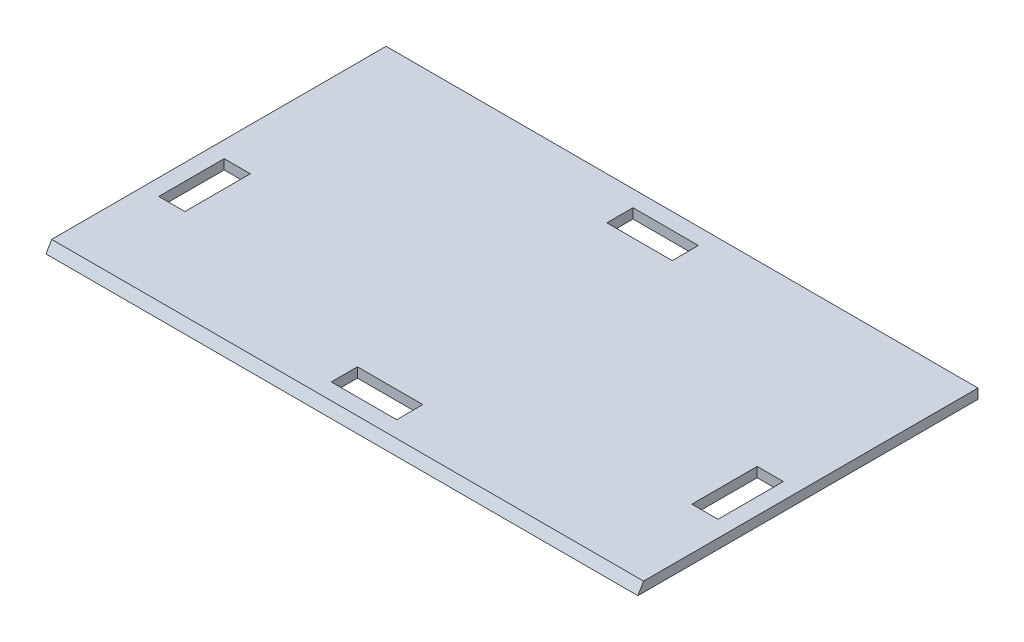
ISO-10303-21;
HEADER;
FILE_DESCRIPTION(('STEP AP214'),'2;1');
FILE_NAME('part.step','',(''),(''),'','','');
FILE_SCHEMA(('AUTOMOTIVE_DESIGN { 1 0 10303 214 1 1 1 1 }'));
ENDSEC;
DATA;
#1=APPLICATION_CONTEXT('core data for automotive mechanical design processes');
#2=APPLICATION_PROTOCOL_DEFINITION('international standard','automotive_design',2000,#1);
#3=PRODUCT_CONTEXT('',#1,'mechanical');
#4=PRODUCT('Part','Part','',(#3));
#5=PRODUCT_RELATED_PRODUCT_CATEGORY('part','',(#4));
#6=PRODUCT_DEFINITION_FORMATION('','',#4);
#7=PRODUCT_DEFINITION_CONTEXT('part definition',#1,'design');
#8=PRODUCT_DEFINITION('design','',#6,#7);
#9=PRODUCT_DEFINITION_SHAPE('','',#8);
#10=(LENGTH_UNIT() NAMED_UNIT(*) SI_UNIT(.MILLI.,.METRE.));
#11=(NAMED_UNIT(*) PLANE_ANGLE_UNIT() SI_UNIT($,.RADIAN.));
#12=(NAMED_UNIT(*) SI_UNIT($,.STERADIAN.) SOLID_ANGLE_UNIT());
#13=UNCERTAINTY_MEASURE_WITH_UNIT(LENGTH_MEASURE(1.E-05),#10,'distance_accuracy_value','');
#14=(GEOMETRIC_REPRESENTATION_CONTEXT(3) GLOBAL_UNCERTAINTY_ASSIGNED_CONTEXT((#13)) GLOBAL_UNIT_ASSIGNED_CONTEXT((#10,
#11,#12)) REPRESENTATION_CONTEXT('',''));
#15=CARTESIAN_POINT('',(0.,0.,0.));
#16=DIRECTION('',(0.,0.,1.));
#17=DIRECTION('',(1.,0.,0.));
#18=AXIS2_PLACEMENT_3D('',#15,#16,#17);
#19=CARTESIAN_POINT('',(-181.,16.1816182466845,-0.351294642809544));
#20=DIRECTION('',(0.,-1.,0.));
#21=DIRECTION('',(0.,0.,-1.));
#22=AXIS2_PLACEMENT_3D('',#19,#20,#21);
#23=PLANE('',#22);
#24=DIRECTION('',(0.,0.,-1.));
#25=VECTOR('',#24,1.);
#26=CARTESIAN_POINT('',(-100.499224225358,16.1816182466845,-0.351294642809544));
#27=LINE('',#26,#25);
#28=CARTESIAN_POINT('',(-100.499224225358,16.1816182466845,-91.3512946428095));
#29=VERTEX_POINT('',#28);
#30=CARTESIAN_POINT('',(-100.499224225358,16.1816182466845,-99.3512946428095));
#31=VERTEX_POINT('',#30);
#32=EDGE_CURVE('E301',#29,#31,#27,.T.);
#33=ORIENTED_EDGE('',*,*,#32,.F.);
#34=DIRECTION('',(-1.,0.,0.));
#35=VECTOR('',#34,1.);
#36=CARTESIAN_POINT('',(-181.,16.1816182466845,-91.3512946428095));
#37=LINE('',#36,#35);
#38=CARTESIAN_POINT('',(-80.4992242253577,16.1816182466845,-91.3512946428095));
#39=VERTEX_POINT('',#38);
#40=EDGE_CURVE('E294',#39,#29,#37,.T.);
#41=ORIENTED_EDGE('',*,*,#40,.F.);
#42=DIRECTION('',(0.,0.,1.));
#43=VECTOR('',#42,1.);
#44=CARTESIAN_POINT('',(-80.4992242253575,16.1816182466845,-0.351294642809718));
#45=LINE('',#44,#43);
#46=CARTESIAN_POINT('',(-80.4992242253577,16.1816182466845,-99.3512946428095));
#47=VERTEX_POINT('',#46);
#48=EDGE_CURVE('E296',#47,#39,#45,.T.);
#49=ORIENTED_EDGE('',*,*,#48,.F.);
#50=DIRECTION('',(1.,0.,0.));
#51=VECTOR('',#50,1.);
#52=CARTESIAN_POINT('',(-181.,16.1816182466845,-99.3512946428095));
#53=LINE('',#52,#51);
#54=EDGE_CURVE('E299',#31,#47,#53,.T.);
#55=ORIENTED_EDGE('',*,*,#54,.F.);
#56=EDGE_LOOP('',(#33,#41,#49,#55));
#57=FACE_BOUND('',#56,.T.);
#58=DIRECTION('',(0.,0.,1.));
#59=VECTOR('',#58,1.);
#60=CARTESIAN_POINT('',(-4.99922422535767,16.1816182466845,-0.351294642809567));
#61=LINE('',#60,#59);
#62=CARTESIAN_POINT('',(-4.99922422535766,16.1816182466845,-49.8315486806539));
#63=VERTEX_POINT('',#62);
#64=CARTESIAN_POINT('',(-4.99922422535766,16.1816182466845,-29.8315486806539));
#65=VERTEX_POINT('',#64);
#66=EDGE_CURVE('E292',#63,#65,#61,.T.);
#67=ORIENTED_EDGE('',*,*,#66,.F.);
#68=DIRECTION('',(1.,0.,0.));
#69=VECTOR('',#68,1.);
#70=CARTESIAN_POINT('',(-181.,16.1816182466845,-49.8315486806539));
#71=LINE('',#70,#69);
#72=CARTESIAN_POINT('',(-12.9992242253577,16.1816182466845,-49.8315486806539));
#73=VERTEX_POINT('',#72);
#74=EDGE_CURVE('E261',#73,#63,#71,.T.);
#75=ORIENTED_EDGE('',*,*,#74,.F.);
#76=DIRECTION('',(0.,0.,-1.));
#77=VECTOR('',#76,1.);
#78=CARTESIAN_POINT('',(-12.9992242253577,16.1816182466845,-0.351294642809544));
#79=LINE('',#78,#77);
#80=CARTESIAN_POINT('',(-12.9992242253577,16.1816182466845,-29.8315486806539));
#81=VERTEX_POINT('',#80);
#82=EDGE_CURVE('E287',#81,#73,#79,.T.);
#83=ORIENTED_EDGE('',*,*,#82,.F.);
#84=DIRECTION('',(-1.,0.,0.));
#85=VECTOR('',#84,1.);
#86=CARTESIAN_POINT('',(-181.,16.1816182466845,-29.8315486806539));
#87=LINE('',#86,#85);
#88=EDGE_CURVE('E290',#65,#81,#87,.T.);
#89=ORIENTED_EDGE('',*,*,#88,.F.);
#90=EDGE_LOOP('',(#67,#75,#83,#89));
#91=FACE_BOUND('',#90,.T.);
#92=DIRECTION('',(0.,0.,-1.));
#93=VECTOR('',#92,1.);
#94=CARTESIAN_POINT('',(0.,16.1816182466845,-0.351294642809544));
#95=LINE('',#94,#93);
#96=CARTESIAN_POINT('',(0.,16.1816182466845,-0.351294642809544));
#97=VERTEX_POINT('',#96);
#98=CARTESIAN_POINT('',(0.,16.1816182466845,-104.35129464281));
#99=VERTEX_POINT('',#98);
#100=EDGE_CURVE('E303',#97,#99,#95,.T.);
#101=ORIENTED_EDGE('',*,*,#100,.F.);
#102=DIRECTION('',(1.,0.,0.));
#103=VECTOR('',#102,1.);
#104=CARTESIAN_POINT('',(-181.,16.1816182466845,-0.351294642809544));
#105=LINE('',#104,#103);
#106=CARTESIAN_POINT('',(-181.,16.1816182466845,-0.351294642809544));
#107=VERTEX_POINT('',#106);
#108=EDGE_CURVE('E11',#107,#97,#105,.T.);
#109=ORIENTED_EDGE('',*,*,#108,.F.);
#110=DIRECTION('',(0.,0.,-1.));
#111=VECTOR('',#110,1.);
#112=CARTESIAN_POINT('',(-181.,16.1816182466845,-0.351294642809544));
#113=LINE('',#112,#111);
#114=CARTESIAN_POINT('',(-181.,16.1816182466845,-104.35129464281));
#115=VERTEX_POINT('',#114);
#116=EDGE_CURVE('E304',#107,#115,#113,.T.);
#117=ORIENTED_EDGE('',*,*,#116,.T.);
#118=DIRECTION('',(1.,0.,0.));
#119=VECTOR('',#118,1.);
#120=CARTESIAN_POINT('',(-181.,16.1816182466845,-104.35129464281));
#121=LINE('',#120,#119);
#122=EDGE_CURVE('E42',#115,#99,#121,.T.);
#123=ORIENTED_EDGE('',*,*,#122,.T.);
#124=EDGE_LOOP('',(#101,#109,#117,#123));
#125=FACE_BOUND('',#124,.T.);
#126=DIRECTION('',(-1.,0.,0.));
#127=VECTOR('',#126,1.);
#128=CARTESIAN_POINT('',(-181.,16.1816182466845,-49.8315486806539));
#129=LINE('',#128,#127);
#130=CARTESIAN_POINT('',(-167.999224225358,16.1816182466845,-49.8315486806539));
#131=VERTEX_POINT('',#130);
#132=CARTESIAN_POINT('',(-175.999224225358,16.1816182466845,-49.8315486806539));
#133=VERTEX_POINT('',#132);
#134=EDGE_CURVE('E239',#131,#133,#129,.T.);
#135=ORIENTED_EDGE('',*,*,#134,.T.);
#136=DIRECTION('',(0.,0.,1.));
#137=VECTOR('',#136,1.);
#138=CARTESIAN_POINT('',(-175.999224225358,16.1816182466845,-0.351294642809543));
#139=LINE('',#138,#137);
#140=CARTESIAN_POINT('',(-175.999224225358,16.1816182466845,-29.8315486806539));
#141=VERTEX_POINT('',#140);
#142=EDGE_CURVE('E242',#133,#141,#139,.T.);
#143=ORIENTED_EDGE('',*,*,#142,.T.);
#144=DIRECTION('',(1.,0.,0.));
#145=VECTOR('',#144,1.);
#146=CARTESIAN_POINT('',(-181.,16.1816182466845,-29.8315486806539));
#147=LINE('',#146,#145);
#148=CARTESIAN_POINT('',(-167.999224225358,16.1816182466845,-29.8315486806539));
#149=VERTEX_POINT('',#148);
#150=EDGE_CURVE('E227',#141,#149,#147,.T.);
#151=ORIENTED_EDGE('',*,*,#150,.T.);
#152=DIRECTION('',(0.,0.,-1.));
#153=VECTOR('',#152,1.);
#154=CARTESIAN_POINT('',(-167.999224225358,16.1816182466845,-0.351294642809544));
#155=LINE('',#154,#153);
#156=EDGE_CURVE('E236',#149,#131,#155,.T.);
#157=ORIENTED_EDGE('',*,*,#156,.T.);
#158=EDGE_LOOP('',(#135,#143,#151,#157));
#159=FACE_BOUND('',#158,.T.);
#160=DIRECTION('',(-1.,0.,0.));
#161=VECTOR('',#160,1.);
#162=CARTESIAN_POINT('',(-181.,16.1816182466845,-15.0812946428096));
#163=LINE('',#162,#161);
#164=CARTESIAN_POINT('',(-80.4992242253577,16.1816182466845,-15.0812946428096));
#165=VERTEX_POINT('',#164);
#166=CARTESIAN_POINT('',(-100.499224225358,16.1816182466845,-15.0812946428096));
#167=VERTEX_POINT('',#166);
#168=EDGE_CURVE('E206',#165,#167,#163,.T.);
#169=ORIENTED_EDGE('',*,*,#168,.T.);
#170=DIRECTION('',(0.,0.,1.));
#171=VECTOR('',#170,1.);
#172=CARTESIAN_POINT('',(-100.499224225358,16.1816182466845,-0.351294642809544));
#173=LINE('',#172,#171);
#174=CARTESIAN_POINT('',(-100.499224225358,16.1816182466845,-7.08129464280954));
#175=VERTEX_POINT('',#174);
#176=EDGE_CURVE('E209',#167,#175,#173,.T.);
#177=ORIENTED_EDGE('',*,*,#176,.T.);
#178=DIRECTION('',(1.,0.,0.));
#179=VECTOR('',#178,1.);
#180=CARTESIAN_POINT('',(-181.,16.1816182466845,-7.08129464280954));
#181=LINE('',#180,#179);
#182=CARTESIAN_POINT('',(-80.4992242253577,16.1816182466845,-7.08129464280954));
#183=VERTEX_POINT('',#182);
#184=EDGE_CURVE('E201',#175,#183,#181,.T.);
#185=ORIENTED_EDGE('',*,*,#184,.T.);
#186=DIRECTION('',(0.,0.,-1.));
#187=VECTOR('',#186,1.);
#188=CARTESIAN_POINT('',(-80.4992242253577,16.1816182466845,-0.351294642809369));
#189=LINE('',#188,#187);
#190=EDGE_CURVE('E182',#183,#165,#189,.T.);
#191=ORIENTED_EDGE('',*,*,#190,.T.);
#192=EDGE_LOOP('',(#169,#177,#185,#191));
#193=FACE_BOUND('',#192,.T.);
#194=ADVANCED_FACE('F39',(#57,#91,#125,#159,#193),#23,.T.);
#195=CARTESIAN_POINT('',(-181.,19.1816182466845,-2.08334545037842));
#196=DIRECTION('',(0.,1.,0.));
#197=DIRECTION('',(0.,0.,1.));
#198=AXIS2_PLACEMENT_3D('',#195,#196,#197);
#199=PLANE('',#198);
#200=DIRECTION('',(0.,0.,1.));
#201=VECTOR('',#200,1.);
#202=CARTESIAN_POINT('',(-100.499224225358,19.1816182466845,-99.3512946428095));
#203=LINE('',#202,#201);
#204=CARTESIAN_POINT('',(-100.499224225358,19.1816182466845,-99.3512946428095));
#205=VERTEX_POINT('',#204);
#206=CARTESIAN_POINT('',(-100.499224225358,19.1816182466845,-91.3512946428095));
#207=VERTEX_POINT('',#206);
#208=EDGE_CURVE('E246',#205,#207,#203,.T.);
#209=ORIENTED_EDGE('',*,*,#208,.F.);
#210=DIRECTION('',(-1.,0.,0.));
#211=VECTOR('',#210,1.);
#212=CARTESIAN_POINT('',(-100.499224225358,19.1816182466845,-99.3512946428095));
#213=LINE('',#212,#211);
#214=CARTESIAN_POINT('',(-80.4992242253577,19.1816182466845,-99.3512946428095));
#215=VERTEX_POINT('',#214);
#216=EDGE_CURVE('E255',#215,#205,#213,.T.);
#217=ORIENTED_EDGE('',*,*,#216,.F.);
#218=DIRECTION('',(0.,0.,-1.));
#219=VECTOR('',#218,1.);
#220=CARTESIAN_POINT('',(-80.4992242253577,19.1816182466845,-99.3512946428095));
#221=LINE('',#220,#219);
#222=CARTESIAN_POINT('',(-80.4992242253577,19.1816182466845,-91.3512946428095));
#223=VERTEX_POINT('',#222);
#224=EDGE_CURVE('E252',#223,#215,#221,.T.);
#225=ORIENTED_EDGE('',*,*,#224,.F.);
#226=DIRECTION('',(1.,0.,0.));
#227=VECTOR('',#226,1.);
#228=CARTESIAN_POINT('',(-100.499224225358,19.1816182466845,-91.3512946428095));
#229=LINE('',#228,#227);
#230=EDGE_CURVE('E248',#207,#223,#229,.T.);
#231=ORIENTED_EDGE('',*,*,#230,.F.);
#232=EDGE_LOOP('',(#209,#217,#225,#231));
#233=FACE_BOUND('',#232,.T.);
#234=DIRECTION('',(0.,0.,-1.));
#235=VECTOR('',#234,1.);
#236=CARTESIAN_POINT('',(-4.99922422535766,19.1816182466845,-49.8315486806539));
#237=LINE('',#236,#235);
#238=CARTESIAN_POINT('',(-4.99922422535766,19.1816182466845,-29.8315486806539));
#239=VERTEX_POINT('',#238);
#240=CARTESIAN_POINT('',(-4.99922422535767,19.1816182466845,-49.8315486806539));
#241=VERTEX_POINT('',#240);
#242=EDGE_CURVE('E249',#239,#241,#237,.T.);
#243=ORIENTED_EDGE('',*,*,#242,.F.);
#244=DIRECTION('',(1.,0.,0.));
#245=VECTOR('',#244,1.);
#246=CARTESIAN_POINT('',(-4.99922422535766,19.1816182466845,-29.8315486806539));
#247=LINE('',#246,#245);
#248=CARTESIAN_POINT('',(-12.9992242253577,19.1816182466845,-29.8315486806539));
#249=VERTEX_POINT('',#248);
#250=EDGE_CURVE('E271',#249,#239,#247,.T.);
#251=ORIENTED_EDGE('',*,*,#250,.F.);
#252=DIRECTION('',(0.,0.,1.));
#253=VECTOR('',#252,1.);
#254=CARTESIAN_POINT('',(-12.9992242253577,19.1816182466845,-49.8315486806539));
#255=LINE('',#254,#253);
#256=CARTESIAN_POINT('',(-12.9992242253577,19.1816182466845,-49.8315486806539));
#257=VERTEX_POINT('',#256);
#258=EDGE_CURVE('E279',#257,#249,#255,.T.);
#259=ORIENTED_EDGE('',*,*,#258,.F.);
#260=DIRECTION('',(-1.,0.,0.));
#261=VECTOR('',#260,1.);
#262=CARTESIAN_POINT('',(-4.99922422535766,19.1816182466845,-49.8315486806539));
#263=LINE('',#262,#261);
#264=EDGE_CURVE('E282',#241,#257,#263,.T.);
#265=ORIENTED_EDGE('',*,*,#264,.F.);
#266=EDGE_LOOP('',(#243,#251,#259,#265));
#267=FACE_BOUND('',#266,.T.);
#268=DIRECTION('',(0.,0.,1.));
#269=VECTOR('',#268,1.);
#270=CARTESIAN_POINT('',(0.,19.1816182466845,-2.08334545037842));
#271=LINE('',#270,#269);
#272=CARTESIAN_POINT('',(0.,19.1816182466845,-104.35129464281));
#273=VERTEX_POINT('',#272);
#274=CARTESIAN_POINT('',(0.,19.1816182466845,-2.08334545037842));
#275=VERTEX_POINT('',#274);
#276=EDGE_CURVE('E322',#273,#275,#271,.T.);
#277=ORIENTED_EDGE('',*,*,#276,.F.);
#278=DIRECTION('',(1.,0.,0.));
#279=VECTOR('',#278,1.);
#280=CARTESIAN_POINT('',(-181.,19.1816182466845,-104.35129464281));
#281=LINE('',#280,#279);
#282=CARTESIAN_POINT('',(-181.,19.1816182466845,-104.35129464281));
#283=VERTEX_POINT('',#282);
#284=EDGE_CURVE('E327',#283,#273,#281,.T.);
#285=ORIENTED_EDGE('',*,*,#284,.F.);
#286=DIRECTION('',(0.,0.,1.));
#287=VECTOR('',#286,1.);
#288=CARTESIAN_POINT('',(-181.,19.1816182466845,-2.08334545037842));
#289=LINE('',#288,#287);
#290=CARTESIAN_POINT('',(-181.,19.1816182466845,-2.08334545037842));
#291=VERTEX_POINT('',#290);
#292=EDGE_CURVE('E311',#283,#291,#289,.T.);
#293=ORIENTED_EDGE('',*,*,#292,.T.);
#294=DIRECTION('',(1.,0.,0.));
#295=VECTOR('',#294,1.);
#296=CARTESIAN_POINT('',(-181.,19.1816182466845,-2.08334545037842));
#297=LINE('',#296,#295);
#298=EDGE_CURVE('E47',#291,#275,#297,.T.);
#299=ORIENTED_EDGE('',*,*,#298,.T.);
#300=EDGE_LOOP('',(#277,#285,#293,#299));
#301=FACE_BOUND('',#300,.T.);
#302=DIRECTION('',(-1.,0.,0.));
#303=VECTOR('',#302,1.);
#304=CARTESIAN_POINT('',(-175.999224225358,19.1816182466845,-29.8315486806539));
#305=LINE('',#304,#303);
#306=CARTESIAN_POINT('',(-167.999224225358,19.1816182466845,-29.8315486806539));
#307=VERTEX_POINT('',#306);
#308=CARTESIAN_POINT('',(-175.999224225358,19.1816182466845,-29.8315486806539));
#309=VERTEX_POINT('',#308);
#310=EDGE_CURVE('E215',#307,#309,#305,.T.);
#311=ORIENTED_EDGE('',*,*,#310,.T.);
#312=DIRECTION('',(0.,0.,-1.));
#313=VECTOR('',#312,1.);
#314=CARTESIAN_POINT('',(-175.999224225358,19.1816182466845,-49.8315486806539));
#315=LINE('',#314,#313);
#316=CARTESIAN_POINT('',(-175.999224225358,19.1816182466845,-49.8315486806539));
#317=VERTEX_POINT('',#316);
#318=EDGE_CURVE('E212',#309,#317,#315,.T.);
#319=ORIENTED_EDGE('',*,*,#318,.T.);
#320=DIRECTION('',(1.,0.,0.));
#321=VECTOR('',#320,1.);
#322=CARTESIAN_POINT('',(-175.999224225358,19.1816182466845,-49.8315486806539));
#323=LINE('',#322,#321);
#324=CARTESIAN_POINT('',(-167.999224225358,19.1816182466845,-49.8315486806539));
#325=VERTEX_POINT('',#324);
#326=EDGE_CURVE('E221',#317,#325,#323,.T.);
#327=ORIENTED_EDGE('',*,*,#326,.T.);
#328=DIRECTION('',(0.,0.,1.));
#329=VECTOR('',#328,1.);
#330=CARTESIAN_POINT('',(-167.999224225358,19.1816182466845,-49.8315486806539));
#331=LINE('',#330,#329);
#332=EDGE_CURVE('E218',#325,#307,#331,.T.);
#333=ORIENTED_EDGE('',*,*,#332,.T.);
#334=EDGE_LOOP('',(#311,#319,#327,#333));
#335=FACE_BOUND('',#334,.T.);
#336=DIRECTION('',(-1.,0.,0.));
#337=VECTOR('',#336,1.);
#338=CARTESIAN_POINT('',(-100.499224225358,19.1816182466845,-7.08129464280954));
#339=LINE('',#338,#337);
#340=CARTESIAN_POINT('',(-80.4992242253577,19.1816182466845,-7.08129464280954));
#341=VERTEX_POINT('',#340);
#342=CARTESIAN_POINT('',(-100.499224225358,19.1816182466845,-7.08129464280954));
#343=VERTEX_POINT('',#342);
#344=EDGE_CURVE('E188',#341,#343,#339,.T.);
#345=ORIENTED_EDGE('',*,*,#344,.T.);
#346=DIRECTION('',(0.,0.,-1.));
#347=VECTOR('',#346,1.);
#348=CARTESIAN_POINT('',(-100.499224225358,19.1816182466845,-7.08129464280954));
#349=LINE('',#348,#347);
#350=CARTESIAN_POINT('',(-100.499224225358,19.1816182466845,-15.0812946428096));
#351=VERTEX_POINT('',#350);
#352=EDGE_CURVE('E63',#343,#351,#349,.T.);
#353=ORIENTED_EDGE('',*,*,#352,.T.);
#354=DIRECTION('',(1.,0.,0.));
#355=VECTOR('',#354,1.);
#356=CARTESIAN_POINT('',(-100.499224225358,19.1816182466845,-15.0812946428096));
#357=LINE('',#356,#355);
#358=CARTESIAN_POINT('',(-80.4992242253577,19.1816182466845,-15.0812946428096));
#359=VERTEX_POINT('',#358);
#360=EDGE_CURVE('E194',#351,#359,#357,.T.);
#361=ORIENTED_EDGE('',*,*,#360,.T.);
#362=DIRECTION('',(0.,0.,1.));
#363=VECTOR('',#362,1.);
#364=CARTESIAN_POINT('',(-80.4992242253577,19.1816182466845,-7.08129464280954));
#365=LINE('',#364,#363);
#366=EDGE_CURVE('E179',#359,#341,#365,.T.);
#367=ORIENTED_EDGE('',*,*,#366,.T.);
#368=EDGE_LOOP('',(#345,#353,#361,#367));
#369=FACE_BOUND('',#368,.T.);
#370=ADVANCED_FACE('F192',(#233,#267,#301,#335,#369),#199,.T.);
#371=CARTESIAN_POINT('',(-181.,16.1816182466845,-0.351294642809544));
#372=DIRECTION('',(0.,0.5,0.866025403784439));
#373=DIRECTION('',(0.,-0.866025403784439,0.5));
#374=AXIS2_PLACEMENT_3D('',#371,#372,#373);
#375=PLANE('',#374);
#376=DIRECTION('',(0.,-0.866025403784439,0.5));
#377=VECTOR('',#376,1.);
#378=CARTESIAN_POINT('',(0.,16.1816182466845,-0.351294642809544));
#379=LINE('',#378,#377);
#380=EDGE_CURVE('E308',#275,#97,#379,.T.);
#381=ORIENTED_EDGE('',*,*,#380,.F.);
#382=ORIENTED_EDGE('',*,*,#298,.F.);
#383=DIRECTION('',(0.,-0.866025403784439,0.5));
#384=VECTOR('',#383,1.);
#385=CARTESIAN_POINT('',(-181.,16.1816182466845,-0.351294642809544));
#386=LINE('',#385,#384);
#387=EDGE_CURVE('E314',#291,#107,#386,.T.);
#388=ORIENTED_EDGE('',*,*,#387,.T.);
#389=ORIENTED_EDGE('',*,*,#108,.T.);
#390=EDGE_LOOP('',(#381,#382,#388,#389));
#391=FACE_BOUND('',#390,.T.);
#392=ADVANCED_FACE('F341',(#391),#375,.T.);
#393=CARTESIAN_POINT('',(-181.,16.1816182466845,-104.35129464281));
#394=DIRECTION('',(0.,0.,-1.));
#395=DIRECTION('',(-1.,0.,0.));
#396=AXIS2_PLACEMENT_3D('',#393,#394,#395);
#397=PLANE('',#396);
#398=DIRECTION('',(0.,1.,0.));
#399=VECTOR('',#398,1.);
#400=CARTESIAN_POINT('',(0.,16.1816182466845,-104.35129464281));
#401=LINE('',#400,#399);
#402=EDGE_CURVE('E319',#99,#273,#401,.T.);
#403=ORIENTED_EDGE('',*,*,#402,.F.);
#404=ORIENTED_EDGE('',*,*,#122,.F.);
#405=DIRECTION('',(0.,1.,0.));
#406=VECTOR('',#405,1.);
#407=CARTESIAN_POINT('',(-181.,16.1816182466845,-104.35129464281));
#408=LINE('',#407,#406);
#409=EDGE_CURVE('E307',#115,#283,#408,.T.);
#410=ORIENTED_EDGE('',*,*,#409,.T.);
#411=ORIENTED_EDGE('',*,*,#284,.T.);
#412=EDGE_LOOP('',(#403,#404,#410,#411));
#413=FACE_BOUND('',#412,.T.);
#414=ADVANCED_FACE('F336',(#413),#397,.T.);
#415=CARTESIAN_POINT('',(-181.,0.,0.));
#416=DIRECTION('',(1.,0.,0.));
#417=DIRECTION('',(0.,0.,-1.));
#418=AXIS2_PLACEMENT_3D('',#415,#416,#417);
#419=PLANE('',#418);
#420=ORIENTED_EDGE('',*,*,#116,.F.);
#421=ORIENTED_EDGE('',*,*,#387,.F.);
#422=ORIENTED_EDGE('',*,*,#292,.F.);
#423=ORIENTED_EDGE('',*,*,#409,.F.);
#424=EDGE_LOOP('',(#420,#421,#422,#423));
#425=FACE_BOUND('',#424,.T.);
#426=ADVANCED_FACE('F344',(#425),#419,.F.);
#427=CARTESIAN_POINT('',(0.,0.,0.));
#428=DIRECTION('',(1.,0.,0.));
#429=DIRECTION('',(0.,0.,-1.));
#430=AXIS2_PLACEMENT_3D('',#427,#428,#429);
#431=PLANE('',#430);
#432=ORIENTED_EDGE('',*,*,#100,.T.);
#433=ORIENTED_EDGE('',*,*,#402,.T.);
#434=ORIENTED_EDGE('',*,*,#276,.T.);
#435=ORIENTED_EDGE('',*,*,#380,.T.);
#436=EDGE_LOOP('',(#432,#433,#434,#435));
#437=FACE_BOUND('',#436,.T.);
#438=ADVANCED_FACE('F338',(#437),#431,.T.);
#439=CARTESIAN_POINT('',(-4.99922422535766,15.1816182466845,-49.8315486806539));
#440=DIRECTION('',(1.,0.,0.));
#441=DIRECTION('',(0.,0.,-1.));
#442=AXIS2_PLACEMENT_3D('',#439,#440,#441);
#443=PLANE('',#442);
#444=ORIENTED_EDGE('',*,*,#66,.T.);
#445=DIRECTION('',(0.,1.,0.));
#446=VECTOR('',#445,1.);
#447=CARTESIAN_POINT('',(-4.99922422535766,15.1816182466845,-29.8315486806539));
#448=LINE('',#447,#446);
#449=EDGE_CURVE('E245',#65,#239,#448,.T.);
#450=ORIENTED_EDGE('',*,*,#449,.T.);
#451=ORIENTED_EDGE('',*,*,#242,.T.);
#452=DIRECTION('',(0.,1.,0.));
#453=VECTOR('',#452,1.);
#454=CARTESIAN_POINT('',(-4.99922422535766,15.1816182466845,-49.8315486806539));
#455=LINE('',#454,#453);
#456=EDGE_CURVE('E268',#63,#241,#455,.T.);
#457=ORIENTED_EDGE('',*,*,#456,.F.);
#458=EDGE_LOOP('',(#444,#450,#451,#457));
#459=FACE_BOUND('',#458,.T.);
#460=ADVANCED_FACE('F391',(#459),#443,.F.);
#461=CARTESIAN_POINT('',(-4.99922422535766,15.1816182466845,-29.8315486806539));
#462=DIRECTION('',(0.,0.,1.));
#463=DIRECTION('',(1.,0.,0.));
#464=AXIS2_PLACEMENT_3D('',#461,#462,#463);
#465=PLANE('',#464);
#466=ORIENTED_EDGE('',*,*,#88,.T.);
#467=DIRECTION('',(0.,1.,0.));
#468=VECTOR('',#467,1.);
#469=CARTESIAN_POINT('',(-12.9992242253577,15.1816182466845,-29.8315486806539));
#470=LINE('',#469,#468);
#471=EDGE_CURVE('E274',#81,#249,#470,.T.);
#472=ORIENTED_EDGE('',*,*,#471,.T.);
#473=ORIENTED_EDGE('',*,*,#250,.T.);
#474=ORIENTED_EDGE('',*,*,#449,.F.);
#475=EDGE_LOOP('',(#466,#472,#473,#474));
#476=FACE_BOUND('',#475,.T.);
#477=ADVANCED_FACE('F393',(#476),#465,.F.);
#478=CARTESIAN_POINT('',(-12.9992242253577,15.1816182466845,-49.8315486806539));
#479=DIRECTION('',(-1.,0.,0.));
#480=DIRECTION('',(0.,0.,1.));
#481=AXIS2_PLACEMENT_3D('',#478,#479,#480);
#482=PLANE('',#481);
#483=ORIENTED_EDGE('',*,*,#82,.T.);
#484=DIRECTION('',(0.,1.,0.));
#485=VECTOR('',#484,1.);
#486=CARTESIAN_POINT('',(-12.9992242253577,15.1816182466845,-49.8315486806539));
#487=LINE('',#486,#485);
#488=EDGE_CURVE('E272',#73,#257,#487,.T.);
#489=ORIENTED_EDGE('',*,*,#488,.T.);
#490=ORIENTED_EDGE('',*,*,#258,.T.);
#491=ORIENTED_EDGE('',*,*,#471,.F.);
#492=EDGE_LOOP('',(#483,#489,#490,#491));
#493=FACE_BOUND('',#492,.T.);
#494=ADVANCED_FACE('F403',(#493),#482,.F.);
#495=CARTESIAN_POINT('',(-4.99922422535766,15.1816182466845,-49.8315486806539));
#496=DIRECTION('',(0.,0.,-1.));
#497=DIRECTION('',(-1.,0.,0.));
#498=AXIS2_PLACEMENT_3D('',#495,#496,#497);
#499=PLANE('',#498);
#500=ORIENTED_EDGE('',*,*,#74,.T.);
#501=ORIENTED_EDGE('',*,*,#456,.T.);
#502=ORIENTED_EDGE('',*,*,#264,.T.);
#503=ORIENTED_EDGE('',*,*,#488,.F.);
#504=EDGE_LOOP('',(#500,#501,#502,#503));
#505=FACE_BOUND('',#504,.T.);
#506=ADVANCED_FACE('F401',(#505),#499,.F.);
#507=CARTESIAN_POINT('',(-100.499224225358,15.1816182466845,-99.3512946428095));
#508=DIRECTION('',(-1.,0.,0.));
#509=DIRECTION('',(0.,0.,1.));
#510=AXIS2_PLACEMENT_3D('',#507,#508,#509);
#511=PLANE('',#510);
#512=ORIENTED_EDGE('',*,*,#32,.T.);
#513=DIRECTION('',(0.,1.,0.));
#514=VECTOR('',#513,1.);
#515=CARTESIAN_POINT('',(-100.499224225358,15.1816182466845,-99.3512946428095));
#516=LINE('',#515,#514);
#517=EDGE_CURVE('E259',#31,#205,#516,.T.);
#518=ORIENTED_EDGE('',*,*,#517,.T.);
#519=ORIENTED_EDGE('',*,*,#208,.T.);
#520=DIRECTION('',(0.,1.,0.));
#521=VECTOR('',#520,1.);
#522=CARTESIAN_POINT('',(-100.499224225358,15.1816182466845,-91.3512946428095));
#523=LINE('',#522,#521);
#524=EDGE_CURVE('E258',#29,#207,#523,.T.);
#525=ORIENTED_EDGE('',*,*,#524,.F.);
#526=EDGE_LOOP('',(#512,#518,#519,#525));
#527=FACE_BOUND('',#526,.T.);
#528=ADVANCED_FACE('F410',(#527),#511,.F.);
#529=CARTESIAN_POINT('',(-100.499224225358,15.1816182466845,-99.3512946428095));
#530=DIRECTION('',(0.,0.,-1.));
#531=DIRECTION('',(-1.,0.,0.));
#532=AXIS2_PLACEMENT_3D('',#529,#530,#531);
#533=PLANE('',#532);
#534=ORIENTED_EDGE('',*,*,#54,.T.);
#535=DIRECTION('',(0.,1.,0.));
#536=VECTOR('',#535,1.);
#537=CARTESIAN_POINT('',(-80.4992242253577,15.1816182466845,-99.3512946428095));
#538=LINE('',#537,#536);
#539=EDGE_CURVE('E262',#47,#215,#538,.T.);
#540=ORIENTED_EDGE('',*,*,#539,.T.);
#541=ORIENTED_EDGE('',*,*,#216,.T.);
#542=ORIENTED_EDGE('',*,*,#517,.F.);
#543=EDGE_LOOP('',(#534,#540,#541,#542));
#544=FACE_BOUND('',#543,.T.);
#545=ADVANCED_FACE('F464',(#544),#533,.F.);
#546=CARTESIAN_POINT('',(-80.4992242253577,15.1816182466845,-99.3512946428095));
#547=DIRECTION('',(1.,0.,0.));
#548=DIRECTION('',(0.,0.,-1.));
#549=AXIS2_PLACEMENT_3D('',#546,#547,#548);
#550=PLANE('',#549);
#551=ORIENTED_EDGE('',*,*,#48,.T.);
#552=DIRECTION('',(0.,1.,0.));
#553=VECTOR('',#552,1.);
#554=CARTESIAN_POINT('',(-80.4992242253577,15.1816182466845,-91.3512946428095));
#555=LINE('',#554,#553);
#556=EDGE_CURVE('E264',#39,#223,#555,.T.);
#557=ORIENTED_EDGE('',*,*,#556,.T.);
#558=ORIENTED_EDGE('',*,*,#224,.T.);
#559=ORIENTED_EDGE('',*,*,#539,.F.);
#560=EDGE_LOOP('',(#551,#557,#558,#559));
#561=FACE_BOUND('',#560,.T.);
#562=ADVANCED_FACE('F475',(#561),#550,.F.);
#563=CARTESIAN_POINT('',(-100.499224225358,15.1816182466845,-91.3512946428095));
#564=DIRECTION('',(0.,0.,1.));
#565=DIRECTION('',(1.,0.,0.));
#566=AXIS2_PLACEMENT_3D('',#563,#564,#565);
#567=PLANE('',#566);
#568=ORIENTED_EDGE('',*,*,#40,.T.);
#569=ORIENTED_EDGE('',*,*,#524,.T.);
#570=ORIENTED_EDGE('',*,*,#230,.T.);
#571=ORIENTED_EDGE('',*,*,#556,.F.);
#572=EDGE_LOOP('',(#568,#569,#570,#571));
#573=FACE_BOUND('',#572,.T.);
#574=ADVANCED_FACE('F486',(#573),#567,.F.);
#575=CARTESIAN_POINT('',(-175.999224225358,15.1816182466845,-49.8315486806539));
#576=DIRECTION('',(1.,0.,0.));
#577=DIRECTION('',(0.,0.,-1.));
#578=AXIS2_PLACEMENT_3D('',#575,#576,#577);
#579=PLANE('',#578);
#580=DIRECTION('',(0.,1.,0.));
#581=VECTOR('',#580,1.);
#582=CARTESIAN_POINT('',(-175.999224225358,15.1816182466845,-49.8315486806539));
#583=LINE('',#582,#581);
#584=EDGE_CURVE('E225',#133,#317,#583,.T.);
#585=ORIENTED_EDGE('',*,*,#584,.T.);
#586=ORIENTED_EDGE('',*,*,#318,.F.);
#587=DIRECTION('',(0.,1.,0.));
#588=VECTOR('',#587,1.);
#589=CARTESIAN_POINT('',(-175.999224225358,15.1816182466845,-29.8315486806539));
#590=LINE('',#589,#588);
#591=EDGE_CURVE('E224',#141,#309,#590,.T.);
#592=ORIENTED_EDGE('',*,*,#591,.F.);
#593=ORIENTED_EDGE('',*,*,#142,.F.);
#594=EDGE_LOOP('',(#585,#586,#592,#593));
#595=FACE_BOUND('',#594,.T.);
#596=ADVANCED_FACE('F358',(#595),#579,.T.);
#597=CARTESIAN_POINT('',(-175.999224225358,15.1816182466845,-49.8315486806539));
#598=DIRECTION('',(0.,0.,1.));
#599=DIRECTION('',(1.,0.,0.));
#600=AXIS2_PLACEMENT_3D('',#597,#598,#599);
#601=PLANE('',#600);
#602=DIRECTION('',(0.,1.,0.));
#603=VECTOR('',#602,1.);
#604=CARTESIAN_POINT('',(-167.999224225358,15.1816182466845,-49.8315486806539));
#605=LINE('',#604,#603);
#606=EDGE_CURVE('E228',#131,#325,#605,.T.);
#607=ORIENTED_EDGE('',*,*,#606,.T.);
#608=ORIENTED_EDGE('',*,*,#326,.F.);
#609=ORIENTED_EDGE('',*,*,#584,.F.);
#610=ORIENTED_EDGE('',*,*,#134,.F.);
#611=EDGE_LOOP('',(#607,#608,#609,#610));
#612=FACE_BOUND('',#611,.T.);
#613=ADVANCED_FACE('F363',(#612),#601,.T.);
#614=CARTESIAN_POINT('',(-167.999224225358,15.1816182466845,-49.8315486806539));
#615=DIRECTION('',(-1.,0.,0.));
#616=DIRECTION('',(0.,0.,1.));
#617=AXIS2_PLACEMENT_3D('',#614,#615,#616);
#618=PLANE('',#617);
#619=DIRECTION('',(0.,1.,0.));
#620=VECTOR('',#619,1.);
#621=CARTESIAN_POINT('',(-167.999224225358,15.1816182466845,-29.8315486806539));
#622=LINE('',#621,#620);
#623=EDGE_CURVE('E230',#149,#307,#622,.T.);
#624=ORIENTED_EDGE('',*,*,#623,.T.);
#625=ORIENTED_EDGE('',*,*,#332,.F.);
#626=ORIENTED_EDGE('',*,*,#606,.F.);
#627=ORIENTED_EDGE('',*,*,#156,.F.);
#628=EDGE_LOOP('',(#624,#625,#626,#627));
#629=FACE_BOUND('',#628,.T.);
#630=ADVANCED_FACE('F366',(#629),#618,.T.);
#631=CARTESIAN_POINT('',(-175.999224225358,15.1816182466845,-29.8315486806539));
#632=DIRECTION('',(0.,0.,-1.));
#633=DIRECTION('',(-1.,0.,0.));
#634=AXIS2_PLACEMENT_3D('',#631,#632,#633);
#635=PLANE('',#634);
#636=ORIENTED_EDGE('',*,*,#591,.T.);
#637=ORIENTED_EDGE('',*,*,#310,.F.);
#638=ORIENTED_EDGE('',*,*,#623,.F.);
#639=ORIENTED_EDGE('',*,*,#150,.F.);
#640=EDGE_LOOP('',(#636,#637,#638,#639));
#641=FACE_BOUND('',#640,.T.);
#642=ADVANCED_FACE('F354',(#641),#635,.T.);
#643=CARTESIAN_POINT('',(-100.499224225358,15.1816182466845,-7.08129464280954));
#644=DIRECTION('',(1.,0.,0.));
#645=DIRECTION('',(0.,0.,-1.));
#646=AXIS2_PLACEMENT_3D('',#643,#644,#645);
#647=PLANE('',#646);
#648=DIRECTION('',(0.,1.,0.));
#649=VECTOR('',#648,1.);
#650=CARTESIAN_POINT('',(-100.499224225358,15.1816182466845,-15.0812946428096));
#651=LINE('',#650,#649);
#652=EDGE_CURVE('E199',#167,#351,#651,.T.);
#653=ORIENTED_EDGE('',*,*,#652,.T.);
#654=ORIENTED_EDGE('',*,*,#352,.F.);
#655=DIRECTION('',(0.,1.,0.));
#656=VECTOR('',#655,1.);
#657=CARTESIAN_POINT('',(-100.499224225358,15.1816182466845,-7.08129464280954));
#658=LINE('',#657,#656);
#659=EDGE_CURVE('E185',#175,#343,#658,.T.);
#660=ORIENTED_EDGE('',*,*,#659,.F.);
#661=ORIENTED_EDGE('',*,*,#176,.F.);
#662=EDGE_LOOP('',(#653,#654,#660,#661));
#663=FACE_BOUND('',#662,.T.);
#664=ADVANCED_FACE('F373',(#663),#647,.T.);
#665=CARTESIAN_POINT('',(-100.499224225358,15.1816182466845,-15.0812946428096));
#666=DIRECTION('',(0.,0.,1.));
#667=DIRECTION('',(1.,0.,0.));
#668=AXIS2_PLACEMENT_3D('',#665,#666,#667);
#669=PLANE('',#668);
#670=DIRECTION('',(0.,1.,0.));
#671=VECTOR('',#670,1.);
#672=CARTESIAN_POINT('',(-80.4992242253577,15.1816182466845,-15.0812946428096));
#673=LINE('',#672,#671);
#674=EDGE_CURVE('E184',#165,#359,#673,.T.);
#675=ORIENTED_EDGE('',*,*,#674,.T.);
#676=ORIENTED_EDGE('',*,*,#360,.F.);
#677=ORIENTED_EDGE('',*,*,#652,.F.);
#678=ORIENTED_EDGE('',*,*,#168,.F.);
#679=EDGE_LOOP('',(#675,#676,#677,#678));
#680=FACE_BOUND('',#679,.T.);
#681=ADVANCED_FACE('F536',(#680),#669,.T.);
#682=CARTESIAN_POINT('',(-80.4992242253577,15.1816182466845,-7.08129464280954));
#683=DIRECTION('',(-1.,0.,0.));
#684=DIRECTION('',(0.,0.,1.));
#685=AXIS2_PLACEMENT_3D('',#682,#683,#684);
#686=PLANE('',#685);
#687=DIRECTION('',(0.,1.,0.));
#688=VECTOR('',#687,1.);
#689=CARTESIAN_POINT('',(-80.4992242253577,15.1816182466845,-7.08129464280954));
#690=LINE('',#689,#688);
#691=EDGE_CURVE('E55',#183,#341,#690,.T.);
#692=ORIENTED_EDGE('',*,*,#691,.T.);
#693=ORIENTED_EDGE('',*,*,#366,.F.);
#694=ORIENTED_EDGE('',*,*,#674,.F.);
#695=ORIENTED_EDGE('',*,*,#190,.F.);
#696=EDGE_LOOP('',(#692,#693,#694,#695));
#697=FACE_BOUND('',#696,.T.);
#698=ADVANCED_FACE('F176',(#697),#686,.T.);
#699=CARTESIAN_POINT('',(-100.499224225358,15.1816182466845,-7.08129464280954));
#700=DIRECTION('',(0.,0.,-1.));
#701=DIRECTION('',(-1.,0.,0.));
#702=AXIS2_PLACEMENT_3D('',#699,#700,#701);
#703=PLANE('',#702);
#704=ORIENTED_EDGE('',*,*,#659,.T.);
#705=ORIENTED_EDGE('',*,*,#344,.F.);
#706=ORIENTED_EDGE('',*,*,#691,.F.);
#707=ORIENTED_EDGE('',*,*,#184,.F.);
#708=EDGE_LOOP('',(#704,#705,#706,#707));
#709=FACE_BOUND('',#708,.T.);
#710=ADVANCED_FACE('F189',(#709),#703,.T.);
#711=CLOSED_SHELL('',(#194,#370,#392,#414,#426,#438,#460,#477,#494,#506,#528,#545,#562,#574,
#596,#613,#630,#642,#664,#681,#698,#710));
#712=MANIFOLD_SOLID_BREP('B2',#711);
#713=ADVANCED_BREP_SHAPE_REPRESENTATION('',(#18,#712),#14);
#714=SHAPE_DEFINITION_REPRESENTATION(#9,#713);
ENDSEC;
END-ISO-10303-21;
